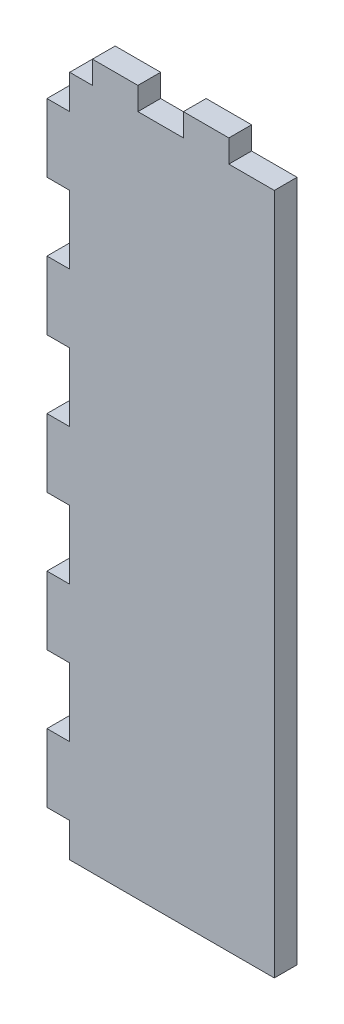
ISO-10303-21;
HEADER;
FILE_DESCRIPTION(('STEP AP214'),'2;1');
FILE_NAME('part.step','',(''),(''),'','','');
FILE_SCHEMA(('AUTOMOTIVE_DESIGN { 1 0 10303 214 1 1 1 1 }'));
ENDSEC;
DATA;
#1=APPLICATION_CONTEXT('core data for automotive mechanical design processes');
#2=APPLICATION_PROTOCOL_DEFINITION('international standard','automotive_design',2000,#1);
#3=PRODUCT_CONTEXT('',#1,'mechanical');
#4=PRODUCT('Part','Part','',(#3));
#5=PRODUCT_RELATED_PRODUCT_CATEGORY('part','',(#4));
#6=PRODUCT_DEFINITION_FORMATION('','',#4);
#7=PRODUCT_DEFINITION_CONTEXT('part definition',#1,'design');
#8=PRODUCT_DEFINITION('design','',#6,#7);
#9=PRODUCT_DEFINITION_SHAPE('','',#8);
#10=(LENGTH_UNIT() NAMED_UNIT(*) SI_UNIT(.MILLI.,.METRE.));
#11=(NAMED_UNIT(*) PLANE_ANGLE_UNIT() SI_UNIT($,.RADIAN.));
#12=(NAMED_UNIT(*) SI_UNIT($,.STERADIAN.) SOLID_ANGLE_UNIT());
#13=UNCERTAINTY_MEASURE_WITH_UNIT(LENGTH_MEASURE(1.E-05),#10,'distance_accuracy_value','');
#14=(GEOMETRIC_REPRESENTATION_CONTEXT(3) GLOBAL_UNCERTAINTY_ASSIGNED_CONTEXT((#13)) GLOBAL_UNIT_ASSIGNED_CONTEXT((#10,
#11,#12)) REPRESENTATION_CONTEXT('',''));
#15=CARTESIAN_POINT('',(0.,0.,0.));
#16=DIRECTION('',(0.,0.,1.));
#17=DIRECTION('',(1.,0.,0.));
#18=AXIS2_PLACEMENT_3D('',#15,#16,#17);
#19=CARTESIAN_POINT('',(0.,0.,5.));
#20=DIRECTION('',(0.,0.,-1.));
#21=DIRECTION('',(-1.,0.,0.));
#22=AXIS2_PLACEMENT_3D('',#19,#20,#21);
#23=PLANE('',#22);
#24=DIRECTION('',(0.,-1.,0.));
#25=VECTOR('',#24,1.);
#26=CARTESIAN_POINT('',(-52.8399776453055,44.7727272727273,5.));
#27=LINE('',#26,#25);
#28=CARTESIAN_POINT('',(-52.8399776453055,44.7727272727273,5.));
#29=VERTEX_POINT('',#28);
#30=CARTESIAN_POINT('',(-52.8399776453055,37.2727272727273,5.));
#31=VERTEX_POINT('',#30);
#32=EDGE_CURVE('E50',#29,#31,#27,.T.);
#33=ORIENTED_EDGE('',*,*,#32,.T.);
#34=DIRECTION('',(1.,0.,0.));
#35=VECTOR('',#34,1.);
#36=CARTESIAN_POINT('',(-57.8399776453055,37.2727272727273,5.));
#37=LINE('',#36,#35);
#38=CARTESIAN_POINT('',(-57.8399776453055,37.2727272727273,5.));
#39=VERTEX_POINT('',#38);
#40=EDGE_CURVE('E639',#39,#31,#37,.T.);
#41=ORIENTED_EDGE('',*,*,#40,.F.);
#42=DIRECTION('',(0.,-1.,0.));
#43=VECTOR('',#42,1.);
#44=CARTESIAN_POINT('',(-57.8399776453055,49.7727272727273,5.));
#45=LINE('',#44,#43);
#46=CARTESIAN_POINT('',(-57.8399776453055,22.2727272727273,5.));
#47=VERTEX_POINT('',#46);
#48=EDGE_CURVE('E43',#39,#47,#45,.T.);
#49=ORIENTED_EDGE('',*,*,#48,.T.);
#50=DIRECTION('',(1.,0.,0.));
#51=VECTOR('',#50,1.);
#52=CARTESIAN_POINT('',(-57.8399776453055,22.2727272727273,5.));
#53=LINE('',#52,#51);
#54=CARTESIAN_POINT('',(-52.8399776453055,22.2727272727273,5.));
#55=VERTEX_POINT('',#54);
#56=EDGE_CURVE('E359',#47,#55,#53,.T.);
#57=ORIENTED_EDGE('',*,*,#56,.T.);
#58=DIRECTION('',(0.,-1.,0.));
#59=VECTOR('',#58,1.);
#60=CARTESIAN_POINT('',(-52.8399776453055,22.2727272727273,5.));
#61=LINE('',#60,#59);
#62=CARTESIAN_POINT('',(-52.8399776453055,7.27272727272727,5.));
#63=VERTEX_POINT('',#62);
#64=EDGE_CURVE('E362',#55,#63,#61,.T.);
#65=ORIENTED_EDGE('',*,*,#64,.T.);
#66=DIRECTION('',(1.,0.,0.));
#67=VECTOR('',#66,1.);
#68=CARTESIAN_POINT('',(-57.8399776453055,7.27272727272727,5.));
#69=LINE('',#68,#67);
#70=CARTESIAN_POINT('',(-57.8399776453055,7.27272727272727,5.));
#71=VERTEX_POINT('',#70);
#72=EDGE_CURVE('E366',#71,#63,#69,.T.);
#73=ORIENTED_EDGE('',*,*,#72,.F.);
#74=CARTESIAN_POINT('',(-57.8399776453055,-7.72727272727273,5.));
#75=VERTEX_POINT('',#74);
#76=EDGE_CURVE('E424',#71,#75,#45,.T.);
#77=ORIENTED_EDGE('',*,*,#76,.T.);
#78=DIRECTION('',(1.,0.,0.));
#79=VECTOR('',#78,1.);
#80=CARTESIAN_POINT('',(-57.8399776453055,-7.72727272727273,5.));
#81=LINE('',#80,#79);
#82=CARTESIAN_POINT('',(-52.8399776453055,-7.72727272727273,5.));
#83=VERTEX_POINT('',#82);
#84=EDGE_CURVE('E383',#75,#83,#81,.T.);
#85=ORIENTED_EDGE('',*,*,#84,.T.);
#86=DIRECTION('',(0.,-1.,0.));
#87=VECTOR('',#86,1.);
#88=CARTESIAN_POINT('',(-52.8399776453055,-7.72727272727273,5.));
#89=LINE('',#88,#87);
#90=CARTESIAN_POINT('',(-52.8399776453055,-22.7272727272727,5.));
#91=VERTEX_POINT('',#90);
#92=EDGE_CURVE('E386',#83,#91,#89,.T.);
#93=ORIENTED_EDGE('',*,*,#92,.T.);
#94=DIRECTION('',(1.,0.,0.));
#95=VECTOR('',#94,1.);
#96=CARTESIAN_POINT('',(-57.8399776453055,-22.7272727272727,5.));
#97=LINE('',#96,#95);
#98=CARTESIAN_POINT('',(-57.8399776453055,-22.7272727272727,5.));
#99=VERTEX_POINT('',#98);
#100=EDGE_CURVE('E389',#99,#91,#97,.T.);
#101=ORIENTED_EDGE('',*,*,#100,.F.);
#102=CARTESIAN_POINT('',(-57.8399776453055,-37.7272727272727,5.));
#103=VERTEX_POINT('',#102);
#104=EDGE_CURVE('E426',#99,#103,#45,.T.);
#105=ORIENTED_EDGE('',*,*,#104,.T.);
#106=DIRECTION('',(1.,0.,0.));
#107=VECTOR('',#106,1.);
#108=CARTESIAN_POINT('',(-57.8399776453055,-37.7272727272727,5.));
#109=LINE('',#108,#107);
#110=CARTESIAN_POINT('',(-52.8399776453055,-37.7272727272727,5.));
#111=VERTEX_POINT('',#110);
#112=EDGE_CURVE('E307',#103,#111,#109,.T.);
#113=ORIENTED_EDGE('',*,*,#112,.T.);
#114=DIRECTION('',(0.,-1.,0.));
#115=VECTOR('',#114,1.);
#116=CARTESIAN_POINT('',(-52.8399776453055,-37.7272727272727,5.));
#117=LINE('',#116,#115);
#118=CARTESIAN_POINT('',(-52.8399776453055,-52.7272727272727,5.));
#119=VERTEX_POINT('',#118);
#120=EDGE_CURVE('E503',#111,#119,#117,.T.);
#121=ORIENTED_EDGE('',*,*,#120,.T.);
#122=DIRECTION('',(1.,0.,0.));
#123=VECTOR('',#122,1.);
#124=CARTESIAN_POINT('',(-57.8399776453055,-52.7272727272727,5.));
#125=LINE('',#124,#123);
#126=CARTESIAN_POINT('',(-57.8399776453055,-52.7272727272727,5.));
#127=VERTEX_POINT('',#126);
#128=EDGE_CURVE('E303',#127,#119,#125,.T.);
#129=ORIENTED_EDGE('',*,*,#128,.F.);
#130=CARTESIAN_POINT('',(-57.8399776453055,-67.7272727272727,5.));
#131=VERTEX_POINT('',#130);
#132=EDGE_CURVE('E425',#127,#131,#45,.T.);
#133=ORIENTED_EDGE('',*,*,#132,.T.);
#134=DIRECTION('',(1.,0.,0.));
#135=VECTOR('',#134,1.);
#136=CARTESIAN_POINT('',(-57.8399776453055,-67.7272727272727,5.));
#137=LINE('',#136,#135);
#138=CARTESIAN_POINT('',(-52.8399776453055,-67.7272727272727,5.));
#139=VERTEX_POINT('',#138);
#140=EDGE_CURVE('E326',#131,#139,#137,.T.);
#141=ORIENTED_EDGE('',*,*,#140,.T.);
#142=DIRECTION('',(0.,-1.,0.));
#143=VECTOR('',#142,1.);
#144=CARTESIAN_POINT('',(-52.8399776453055,-67.7272727272727,5.));
#145=LINE('',#144,#143);
#146=CARTESIAN_POINT('',(-52.8399776453055,-82.7272727272727,5.));
#147=VERTEX_POINT('',#146);
#148=EDGE_CURVE('E322',#139,#147,#145,.T.);
#149=ORIENTED_EDGE('',*,*,#148,.T.);
#150=DIRECTION('',(1.,0.,0.));
#151=VECTOR('',#150,1.);
#152=CARTESIAN_POINT('',(-57.8399776453055,-82.7272727272727,5.));
#153=LINE('',#152,#151);
#154=CARTESIAN_POINT('',(-57.8399776453055,-82.7272727272727,5.));
#155=VERTEX_POINT('',#154);
#156=EDGE_CURVE('E319',#155,#147,#153,.T.);
#157=ORIENTED_EDGE('',*,*,#156,.F.);
#158=CARTESIAN_POINT('',(-57.8399776453055,-97.7272727272727,5.));
#159=VERTEX_POINT('',#158);
#160=EDGE_CURVE('E422',#155,#159,#45,.T.);
#161=ORIENTED_EDGE('',*,*,#160,.T.);
#162=DIRECTION('',(1.,0.,0.));
#163=VECTOR('',#162,1.);
#164=CARTESIAN_POINT('',(-57.8399776453055,-97.7272727272727,5.));
#165=LINE('',#164,#163);
#166=CARTESIAN_POINT('',(-52.8399776453055,-97.7272727272727,5.));
#167=VERTEX_POINT('',#166);
#168=EDGE_CURVE('E342',#159,#167,#165,.T.);
#169=ORIENTED_EDGE('',*,*,#168,.T.);
#170=DIRECTION('',(0.,-1.,0.));
#171=VECTOR('',#170,1.);
#172=CARTESIAN_POINT('',(-52.8399776453055,-97.7272727272727,5.));
#173=LINE('',#172,#171);
#174=CARTESIAN_POINT('',(-52.8399776453055,-105.227272727273,5.));
#175=VERTEX_POINT('',#174);
#176=EDGE_CURVE('E345',#167,#175,#173,.T.);
#177=ORIENTED_EDGE('',*,*,#176,.T.);
#178=DIRECTION('',(1.,0.,0.));
#179=VECTOR('',#178,1.);
#180=CARTESIAN_POINT('',(-57.8399776453055,-105.227272727273,5.));
#181=LINE('',#180,#179);
#182=CARTESIAN_POINT('',(-7.83997764530547,-105.227272727273,5.));
#183=VERTEX_POINT('',#182);
#184=EDGE_CURVE('E420',#175,#183,#181,.T.);
#185=ORIENTED_EDGE('',*,*,#184,.T.);
#186=DIRECTION('',(0.,-1.,0.));
#187=VECTOR('',#186,1.);
#188=CARTESIAN_POINT('',(-7.83997764530549,49.7727272727273,5.));
#189=LINE('',#188,#187);
#190=CARTESIAN_POINT('',(-7.83997764530549,44.7727272727273,5.));
#191=VERTEX_POINT('',#190);
#192=EDGE_CURVE('E417',#191,#183,#189,.T.);
#193=ORIENTED_EDGE('',*,*,#192,.F.);
#194=DIRECTION('',(-1.,0.,0.));
#195=VECTOR('',#194,1.);
#196=CARTESIAN_POINT('',(-7.83997764530549,44.7727272727273,5.));
#197=LINE('',#196,#195);
#198=CARTESIAN_POINT('',(-17.8399776453055,44.7727272727273,5.));
#199=VERTEX_POINT('',#198);
#200=EDGE_CURVE('E401',#191,#199,#197,.T.);
#201=ORIENTED_EDGE('',*,*,#200,.T.);
#202=DIRECTION('',(0.,-1.,0.));
#203=VECTOR('',#202,1.);
#204=CARTESIAN_POINT('',(-17.8399776453055,49.7727272727273,5.));
#205=LINE('',#204,#203);
#206=CARTESIAN_POINT('',(-17.8399776453055,49.7727272727273,5.));
#207=VERTEX_POINT('',#206);
#208=EDGE_CURVE('E392',#207,#199,#205,.T.);
#209=ORIENTED_EDGE('',*,*,#208,.F.);
#210=DIRECTION('',(1.,0.,0.));
#211=VECTOR('',#210,1.);
#212=CARTESIAN_POINT('',(-57.8399776453055,49.7727272727273,5.));
#213=LINE('',#212,#211);
#214=CARTESIAN_POINT('',(-27.8399776453055,49.7727272727273,5.));
#215=VERTEX_POINT('',#214);
#216=EDGE_CURVE('E268',#215,#207,#213,.T.);
#217=ORIENTED_EDGE('',*,*,#216,.F.);
#218=DIRECTION('',(0.,-1.,0.));
#219=VECTOR('',#218,1.);
#220=CARTESIAN_POINT('',(-27.8399776453055,49.7727272727273,5.));
#221=LINE('',#220,#219);
#222=CARTESIAN_POINT('',(-27.8399776453055,44.7727272727273,5.));
#223=VERTEX_POINT('',#222);
#224=EDGE_CURVE('E475',#215,#223,#221,.T.);
#225=ORIENTED_EDGE('',*,*,#224,.T.);
#226=DIRECTION('',(1.,0.,0.));
#227=VECTOR('',#226,1.);
#228=CARTESIAN_POINT('',(-37.8399776453055,44.7727272727273,5.));
#229=LINE('',#228,#227);
#230=CARTESIAN_POINT('',(-37.8399776453055,44.7727272727273,5.));
#231=VERTEX_POINT('',#230);
#232=EDGE_CURVE('E478',#231,#223,#229,.T.);
#233=ORIENTED_EDGE('',*,*,#232,.F.);
#234=DIRECTION('',(0.,-1.,0.));
#235=VECTOR('',#234,1.);
#236=CARTESIAN_POINT('',(-37.8399776453055,49.7727272727273,5.));
#237=LINE('',#236,#235);
#238=CARTESIAN_POINT('',(-37.8399776453055,49.7727272727273,5.));
#239=VERTEX_POINT('',#238);
#240=EDGE_CURVE('E482',#239,#231,#237,.T.);
#241=ORIENTED_EDGE('',*,*,#240,.F.);
#242=CARTESIAN_POINT('',(-47.8399776453055,49.7727272727273,5.));
#243=VERTEX_POINT('',#242);
#244=EDGE_CURVE('E272',#243,#239,#213,.T.);
#245=ORIENTED_EDGE('',*,*,#244,.F.);
#246=DIRECTION('',(0.,1.,0.));
#247=VECTOR('',#246,1.);
#248=CARTESIAN_POINT('',(-47.8399776453055,49.7727272727273,5.));
#249=LINE('',#248,#247);
#250=CARTESIAN_POINT('',(-47.8399776453055,44.7727272727273,5.));
#251=VERTEX_POINT('',#250);
#252=EDGE_CURVE('E58',#251,#243,#249,.T.);
#253=ORIENTED_EDGE('',*,*,#252,.F.);
#254=DIRECTION('',(1.,0.,0.));
#255=VECTOR('',#254,1.);
#256=CARTESIAN_POINT('',(-57.8399776453055,44.7727272727273,5.));
#257=LINE('',#256,#255);
#258=EDGE_CURVE('E647',#29,#251,#257,.T.);
#259=ORIENTED_EDGE('',*,*,#258,.F.);
#260=EDGE_LOOP('',(#33,#41,#49,#57,#65,#73,#77,#85,#93,#101,#105,#113,#121,#129,#133,#141,#149,
#157,#161,#169,#177,#185,#193,#201,#209,#217,#225,#233,#241,#245,#253,#259));
#261=FACE_BOUND('',#260,.T.);
#262=ADVANCED_FACE('F35',(#261),#23,.F.);
#263=CARTESIAN_POINT('',(0.,0.,0.));
#264=DIRECTION('',(0.,0.,-1.));
#265=DIRECTION('',(-1.,0.,0.));
#266=AXIS2_PLACEMENT_3D('',#263,#264,#265);
#267=PLANE('',#266);
#268=DIRECTION('',(1.,0.,0.));
#269=VECTOR('',#268,1.);
#270=CARTESIAN_POINT('',(-57.8399776453055,37.2727272727273,0.));
#271=LINE('',#270,#269);
#272=CARTESIAN_POINT('',(-57.8399776453055,37.2727272727273,0.));
#273=VERTEX_POINT('',#272);
#274=CARTESIAN_POINT('',(-52.8399776453055,37.2727272727273,0.));
#275=VERTEX_POINT('',#274);
#276=EDGE_CURVE('E245',#273,#275,#271,.T.);
#277=ORIENTED_EDGE('',*,*,#276,.T.);
#278=DIRECTION('',(0.,-1.,0.));
#279=VECTOR('',#278,1.);
#280=CARTESIAN_POINT('',(-52.8399776453055,44.7727272727273,0.));
#281=LINE('',#280,#279);
#282=CARTESIAN_POINT('',(-52.8399776453055,44.7727272727273,0.));
#283=VERTEX_POINT('',#282);
#284=EDGE_CURVE('E255',#283,#275,#281,.T.);
#285=ORIENTED_EDGE('',*,*,#284,.F.);
#286=DIRECTION('',(1.,0.,0.));
#287=VECTOR('',#286,1.);
#288=CARTESIAN_POINT('',(-57.8399776453055,44.7727272727273,0.));
#289=LINE('',#288,#287);
#290=CARTESIAN_POINT('',(-47.8399776453055,44.7727272727273,0.));
#291=VERTEX_POINT('',#290);
#292=EDGE_CURVE('E649',#283,#291,#289,.T.);
#293=ORIENTED_EDGE('',*,*,#292,.T.);
#294=DIRECTION('',(0.,1.,0.));
#295=VECTOR('',#294,1.);
#296=CARTESIAN_POINT('',(-47.8399776453055,49.7727272727273,0.));
#297=LINE('',#296,#295);
#298=CARTESIAN_POINT('',(-47.8399776453055,49.7727272727273,0.));
#299=VERTEX_POINT('',#298);
#300=EDGE_CURVE('E651',#291,#299,#297,.T.);
#301=ORIENTED_EDGE('',*,*,#300,.T.);
#302=DIRECTION('',(1.,0.,0.));
#303=VECTOR('',#302,1.);
#304=CARTESIAN_POINT('',(-57.8399776453055,49.7727272727273,0.));
#305=LINE('',#304,#303);
#306=CARTESIAN_POINT('',(-37.8399776453055,49.7727272727273,0.));
#307=VERTEX_POINT('',#306);
#308=EDGE_CURVE('E427',#299,#307,#305,.T.);
#309=ORIENTED_EDGE('',*,*,#308,.T.);
#310=DIRECTION('',(0.,-1.,0.));
#311=VECTOR('',#310,1.);
#312=CARTESIAN_POINT('',(-37.8399776453055,49.7727272727273,0.));
#313=LINE('',#312,#311);
#314=CARTESIAN_POINT('',(-37.8399776453055,44.7727272727273,0.));
#315=VERTEX_POINT('',#314);
#316=EDGE_CURVE('E480',#307,#315,#313,.T.);
#317=ORIENTED_EDGE('',*,*,#316,.T.);
#318=DIRECTION('',(1.,0.,0.));
#319=VECTOR('',#318,1.);
#320=CARTESIAN_POINT('',(-37.8399776453055,44.7727272727273,0.));
#321=LINE('',#320,#319);
#322=CARTESIAN_POINT('',(-27.8399776453055,44.7727272727273,0.));
#323=VERTEX_POINT('',#322);
#324=EDGE_CURVE('E485',#315,#323,#321,.T.);
#325=ORIENTED_EDGE('',*,*,#324,.T.);
#326=DIRECTION('',(0.,-1.,0.));
#327=VECTOR('',#326,1.);
#328=CARTESIAN_POINT('',(-27.8399776453055,49.7727272727273,0.));
#329=LINE('',#328,#327);
#330=CARTESIAN_POINT('',(-27.8399776453055,49.7727272727273,0.));
#331=VERTEX_POINT('',#330);
#332=EDGE_CURVE('E493',#331,#323,#329,.T.);
#333=ORIENTED_EDGE('',*,*,#332,.F.);
#334=CARTESIAN_POINT('',(-17.8399776453055,49.7727272727273,0.));
#335=VERTEX_POINT('',#334);
#336=EDGE_CURVE('E412',#331,#335,#305,.T.);
#337=ORIENTED_EDGE('',*,*,#336,.T.);
#338=DIRECTION('',(0.,-1.,0.));
#339=VECTOR('',#338,1.);
#340=CARTESIAN_POINT('',(-17.8399776453055,49.7727272727273,0.));
#341=LINE('',#340,#339);
#342=CARTESIAN_POINT('',(-17.8399776453055,44.7727272727273,0.));
#343=VERTEX_POINT('',#342);
#344=EDGE_CURVE('E397',#335,#343,#341,.T.);
#345=ORIENTED_EDGE('',*,*,#344,.T.);
#346=DIRECTION('',(-1.,0.,0.));
#347=VECTOR('',#346,1.);
#348=CARTESIAN_POINT('',(-7.83997764530549,44.7727272727273,0.));
#349=LINE('',#348,#347);
#350=CARTESIAN_POINT('',(-7.83997764530549,44.7727272727273,0.));
#351=VERTEX_POINT('',#350);
#352=EDGE_CURVE('E400',#351,#343,#349,.T.);
#353=ORIENTED_EDGE('',*,*,#352,.F.);
#354=DIRECTION('',(0.,-1.,0.));
#355=VECTOR('',#354,1.);
#356=CARTESIAN_POINT('',(-7.83997764530549,49.7727272727273,0.));
#357=LINE('',#356,#355);
#358=CARTESIAN_POINT('',(-7.83997764530547,-105.227272727273,0.));
#359=VERTEX_POINT('',#358);
#360=EDGE_CURVE('E429',#351,#359,#357,.T.);
#361=ORIENTED_EDGE('',*,*,#360,.T.);
#362=DIRECTION('',(1.,0.,0.));
#363=VECTOR('',#362,1.);
#364=CARTESIAN_POINT('',(-57.8399776453055,-105.227272727273,0.));
#365=LINE('',#364,#363);
#366=CARTESIAN_POINT('',(-52.8399776453055,-105.227272727273,0.));
#367=VERTEX_POINT('',#366);
#368=EDGE_CURVE('E431',#367,#359,#365,.T.);
#369=ORIENTED_EDGE('',*,*,#368,.F.);
#370=DIRECTION('',(0.,-1.,0.));
#371=VECTOR('',#370,1.);
#372=CARTESIAN_POINT('',(-52.8399776453055,-97.7272727272727,0.));
#373=LINE('',#372,#371);
#374=CARTESIAN_POINT('',(-52.8399776453055,-97.7272727272727,0.));
#375=VERTEX_POINT('',#374);
#376=EDGE_CURVE('E346',#375,#367,#373,.T.);
#377=ORIENTED_EDGE('',*,*,#376,.F.);
#378=DIRECTION('',(1.,0.,0.));
#379=VECTOR('',#378,1.);
#380=CARTESIAN_POINT('',(-57.8399776453055,-97.7272727272727,0.));
#381=LINE('',#380,#379);
#382=CARTESIAN_POINT('',(-57.8399776453055,-97.7272727272727,0.));
#383=VERTEX_POINT('',#382);
#384=EDGE_CURVE('E337',#383,#375,#381,.T.);
#385=ORIENTED_EDGE('',*,*,#384,.F.);
#386=DIRECTION('',(0.,-1.,0.));
#387=VECTOR('',#386,1.);
#388=CARTESIAN_POINT('',(-57.8399776453055,49.7727272727273,0.));
#389=LINE('',#388,#387);
#390=CARTESIAN_POINT('',(-57.8399776453055,-82.7272727272728,0.));
#391=VERTEX_POINT('',#390);
#392=EDGE_CURVE('E274',#391,#383,#389,.T.);
#393=ORIENTED_EDGE('',*,*,#392,.F.);
#394=DIRECTION('',(1.,0.,0.));
#395=VECTOR('',#394,1.);
#396=CARTESIAN_POINT('',(-57.8399776453055,-82.7272727272727,0.));
#397=LINE('',#396,#395);
#398=CARTESIAN_POINT('',(-52.8399776453055,-82.7272727272727,0.));
#399=VERTEX_POINT('',#398);
#400=EDGE_CURVE('E318',#391,#399,#397,.T.);
#401=ORIENTED_EDGE('',*,*,#400,.T.);
#402=DIRECTION('',(0.,-1.,0.));
#403=VECTOR('',#402,1.);
#404=CARTESIAN_POINT('',(-52.8399776453055,-67.7272727272727,0.));
#405=LINE('',#404,#403);
#406=CARTESIAN_POINT('',(-52.8399776453055,-67.7272727272727,0.));
#407=VERTEX_POINT('',#406);
#408=EDGE_CURVE('E332',#407,#399,#405,.T.);
#409=ORIENTED_EDGE('',*,*,#408,.F.);
#410=DIRECTION('',(1.,0.,0.));
#411=VECTOR('',#410,1.);
#412=CARTESIAN_POINT('',(-57.8399776453055,-67.7272727272727,0.));
#413=LINE('',#412,#411);
#414=CARTESIAN_POINT('',(-57.8399776453055,-67.7272727272727,0.));
#415=VERTEX_POINT('',#414);
#416=EDGE_CURVE('E323',#415,#407,#413,.T.);
#417=ORIENTED_EDGE('',*,*,#416,.F.);
#418=CARTESIAN_POINT('',(-57.8399776453055,-52.7272727272727,0.));
#419=VERTEX_POINT('',#418);
#420=EDGE_CURVE('E270',#419,#415,#389,.T.);
#421=ORIENTED_EDGE('',*,*,#420,.F.);
#422=DIRECTION('',(1.,0.,0.));
#423=VECTOR('',#422,1.);
#424=CARTESIAN_POINT('',(-57.8399776453055,-52.7272727272727,0.));
#425=LINE('',#424,#423);
#426=CARTESIAN_POINT('',(-52.8399776453055,-52.7272727272727,0.));
#427=VERTEX_POINT('',#426);
#428=EDGE_CURVE('E298',#419,#427,#425,.T.);
#429=ORIENTED_EDGE('',*,*,#428,.T.);
#430=DIRECTION('',(0.,-1.,0.));
#431=VECTOR('',#430,1.);
#432=CARTESIAN_POINT('',(-52.8399776453055,-37.7272727272727,0.));
#433=LINE('',#432,#431);
#434=CARTESIAN_POINT('',(-52.8399776453055,-37.7272727272727,0.));
#435=VERTEX_POINT('',#434);
#436=EDGE_CURVE('E293',#435,#427,#433,.T.);
#437=ORIENTED_EDGE('',*,*,#436,.F.);
#438=DIRECTION('',(1.,0.,0.));
#439=VECTOR('',#438,1.);
#440=CARTESIAN_POINT('',(-57.8399776453055,-37.7272727272727,0.));
#441=LINE('',#440,#439);
#442=CARTESIAN_POINT('',(-57.8399776453055,-37.7272727272727,0.));
#443=VERTEX_POINT('',#442);
#444=EDGE_CURVE('E291',#443,#435,#441,.T.);
#445=ORIENTED_EDGE('',*,*,#444,.F.);
#446=CARTESIAN_POINT('',(-57.8399776453055,-22.7272727272727,0.));
#447=VERTEX_POINT('',#446);
#448=EDGE_CURVE('E271',#447,#443,#389,.T.);
#449=ORIENTED_EDGE('',*,*,#448,.F.);
#450=DIRECTION('',(1.,0.,0.));
#451=VECTOR('',#450,1.);
#452=CARTESIAN_POINT('',(-57.8399776453055,-22.7272727272727,0.));
#453=LINE('',#452,#451);
#454=CARTESIAN_POINT('',(-52.8399776453055,-22.7272727272727,0.));
#455=VERTEX_POINT('',#454);
#456=EDGE_CURVE('E289',#447,#455,#453,.T.);
#457=ORIENTED_EDGE('',*,*,#456,.T.);
#458=DIRECTION('',(0.,-1.,0.));
#459=VECTOR('',#458,1.);
#460=CARTESIAN_POINT('',(-52.8399776453055,-7.72727272727273,0.));
#461=LINE('',#460,#459);
#462=CARTESIAN_POINT('',(-52.8399776453055,-7.72727272727273,0.));
#463=VERTEX_POINT('',#462);
#464=EDGE_CURVE('E394',#463,#455,#461,.T.);
#465=ORIENTED_EDGE('',*,*,#464,.F.);
#466=DIRECTION('',(1.,0.,0.));
#467=VECTOR('',#466,1.);
#468=CARTESIAN_POINT('',(-57.8399776453055,-7.72727272727273,0.));
#469=LINE('',#468,#467);
#470=CARTESIAN_POINT('',(-57.8399776453055,-7.72727272727273,0.));
#471=VERTEX_POINT('',#470);
#472=EDGE_CURVE('E376',#471,#463,#469,.T.);
#473=ORIENTED_EDGE('',*,*,#472,.F.);
#474=CARTESIAN_POINT('',(-57.8399776453055,7.27272727272727,0.));
#475=VERTEX_POINT('',#474);
#476=EDGE_CURVE('E269',#475,#471,#389,.T.);
#477=ORIENTED_EDGE('',*,*,#476,.F.);
#478=DIRECTION('',(1.,0.,0.));
#479=VECTOR('',#478,1.);
#480=CARTESIAN_POINT('',(-57.8399776453055,7.27272727272727,0.));
#481=LINE('',#480,#479);
#482=CARTESIAN_POINT('',(-52.8399776453055,7.27272727272727,0.));
#483=VERTEX_POINT('',#482);
#484=EDGE_CURVE('E363',#475,#483,#481,.T.);
#485=ORIENTED_EDGE('',*,*,#484,.T.);
#486=DIRECTION('',(0.,-1.,0.));
#487=VECTOR('',#486,1.);
#488=CARTESIAN_POINT('',(-52.8399776453055,22.2727272727273,0.));
#489=LINE('',#488,#487);
#490=CARTESIAN_POINT('',(-52.8399776453055,22.2727272727273,0.));
#491=VERTEX_POINT('',#490);
#492=EDGE_CURVE('E371',#491,#483,#489,.T.);
#493=ORIENTED_EDGE('',*,*,#492,.F.);
#494=DIRECTION('',(1.,0.,0.));
#495=VECTOR('',#494,1.);
#496=CARTESIAN_POINT('',(-57.8399776453055,22.2727272727273,0.));
#497=LINE('',#496,#495);
#498=CARTESIAN_POINT('',(-57.8399776453055,22.2727272727273,0.));
#499=VERTEX_POINT('',#498);
#500=EDGE_CURVE('E267',#499,#491,#497,.T.);
#501=ORIENTED_EDGE('',*,*,#500,.F.);
#502=EDGE_CURVE('E261',#273,#499,#389,.T.);
#503=ORIENTED_EDGE('',*,*,#502,.F.);
#504=EDGE_LOOP('',(#277,#285,#293,#301,#309,#317,#325,#333,#337,#345,#353,#361,#369,#377,#385,
#393,#401,#409,#417,#421,#429,#437,#445,#449,#457,#465,#473,#477,#485,#493,#501,#503));
#505=FACE_BOUND('',#504,.T.);
#506=ADVANCED_FACE('F265',(#505),#267,.T.);
#507=CARTESIAN_POINT('',(-57.8399776453055,44.7727272727273,0.));
#508=DIRECTION('',(0.,-1.,0.));
#509=DIRECTION('',(0.,0.,-1.));
#510=AXIS2_PLACEMENT_3D('',#507,#508,#509);
#511=PLANE('',#510);
#512=DIRECTION('',(0.,0.,1.));
#513=VECTOR('',#512,1.);
#514=CARTESIAN_POINT('',(-52.8399776453055,44.7727272727273,0.));
#515=LINE('',#514,#513);
#516=EDGE_CURVE('E645',#283,#29,#515,.T.);
#517=ORIENTED_EDGE('',*,*,#516,.T.);
#518=ORIENTED_EDGE('',*,*,#258,.T.);
#519=DIRECTION('',(0.,0.,1.));
#520=VECTOR('',#519,1.);
#521=CARTESIAN_POINT('',(-47.8399776453055,44.7727272727273,0.));
#522=LINE('',#521,#520);
#523=EDGE_CURVE('E654',#291,#251,#522,.T.);
#524=ORIENTED_EDGE('',*,*,#523,.F.);
#525=ORIENTED_EDGE('',*,*,#292,.F.);
#526=EDGE_LOOP('',(#517,#518,#524,#525));
#527=FACE_BOUND('',#526,.T.);
#528=ADVANCED_FACE('F554',(#527),#511,.F.);
#529=CARTESIAN_POINT('',(-57.8399776453055,49.7727272727273,5.));
#530=DIRECTION('',(0.,1.,0.));
#531=DIRECTION('',(0.,0.,1.));
#532=AXIS2_PLACEMENT_3D('',#529,#530,#531);
#533=PLANE('',#532);
#534=ORIENTED_EDGE('',*,*,#336,.F.);
#535=DIRECTION('',(0.,0.,1.));
#536=VECTOR('',#535,1.);
#537=CARTESIAN_POINT('',(-27.8399776453055,49.7727272727273,0.));
#538=LINE('',#537,#536);
#539=EDGE_CURVE('E472',#331,#215,#538,.T.);
#540=ORIENTED_EDGE('',*,*,#539,.T.);
#541=ORIENTED_EDGE('',*,*,#216,.T.);
#542=DIRECTION('',(0.,0.,1.));
#543=VECTOR('',#542,1.);
#544=CARTESIAN_POINT('',(-17.8399776453055,49.7727272727273,0.));
#545=LINE('',#544,#543);
#546=EDGE_CURVE('E404',#335,#207,#545,.T.);
#547=ORIENTED_EDGE('',*,*,#546,.F.);
#548=EDGE_LOOP('',(#534,#540,#541,#547));
#549=FACE_BOUND('',#548,.T.);
#550=ADVANCED_FACE('F469',(#549),#533,.T.);
#551=CARTESIAN_POINT('',(-57.8399776453055,49.7727272727273,5.));
#552=DIRECTION('',(1.,0.,0.));
#553=DIRECTION('',(0.,1.,0.));
#554=AXIS2_PLACEMENT_3D('',#551,#552,#553);
#555=PLANE('',#554);
#556=DIRECTION('',(0.,0.,1.));
#557=VECTOR('',#556,1.);
#558=CARTESIAN_POINT('',(-57.8399776453055,-37.7272727272727,0.));
#559=LINE('',#558,#557);
#560=EDGE_CURVE('E283',#443,#103,#559,.T.);
#561=ORIENTED_EDGE('',*,*,#560,.T.);
#562=ORIENTED_EDGE('',*,*,#104,.F.);
#563=DIRECTION('',(0.,0.,1.));
#564=VECTOR('',#563,1.);
#565=CARTESIAN_POINT('',(-57.8399776453055,-22.7272727272727,0.));
#566=LINE('',#565,#564);
#567=EDGE_CURVE('E285',#447,#99,#566,.T.);
#568=ORIENTED_EDGE('',*,*,#567,.F.);
#569=ORIENTED_EDGE('',*,*,#448,.T.);
#570=EDGE_LOOP('',(#561,#562,#568,#569));
#571=FACE_BOUND('',#570,.T.);
#572=ADVANCED_FACE('F281',(#571),#555,.F.);
#573=ORIENTED_EDGE('',*,*,#132,.F.);
#574=DIRECTION('',(0.,0.,1.));
#575=VECTOR('',#574,1.);
#576=CARTESIAN_POINT('',(-57.8399776453055,-52.7272727272727,0.));
#577=LINE('',#576,#575);
#578=EDGE_CURVE('E296',#419,#127,#577,.T.);
#579=ORIENTED_EDGE('',*,*,#578,.F.);
#580=ORIENTED_EDGE('',*,*,#420,.T.);
#581=DIRECTION('',(0.,0.,1.));
#582=VECTOR('',#581,1.);
#583=CARTESIAN_POINT('',(-57.8399776453055,-67.7272727272727,0.));
#584=LINE('',#583,#582);
#585=EDGE_CURVE('E315',#415,#131,#584,.T.);
#586=ORIENTED_EDGE('',*,*,#585,.T.);
#587=EDGE_LOOP('',(#573,#579,#580,#586));
#588=FACE_BOUND('',#587,.T.);
#589=ADVANCED_FACE('F515',(#588),#555,.F.);
#590=ORIENTED_EDGE('',*,*,#160,.F.);
#591=DIRECTION('',(0.,0.,1.));
#592=VECTOR('',#591,1.);
#593=CARTESIAN_POINT('',(-57.8399776453055,-82.7272727272727,0.));
#594=LINE('',#593,#592);
#595=EDGE_CURVE('E313',#391,#155,#594,.T.);
#596=ORIENTED_EDGE('',*,*,#595,.F.);
#597=ORIENTED_EDGE('',*,*,#392,.T.);
#598=DIRECTION('',(0.,0.,1.));
#599=VECTOR('',#598,1.);
#600=CARTESIAN_POINT('',(-57.8399776453055,-97.7272727272727,0.));
#601=LINE('',#600,#599);
#602=EDGE_CURVE('E329',#383,#159,#601,.T.);
#603=ORIENTED_EDGE('',*,*,#602,.T.);
#604=EDGE_LOOP('',(#590,#596,#597,#603));
#605=FACE_BOUND('',#604,.T.);
#606=ADVANCED_FACE('F441',(#605),#555,.F.);
#607=CARTESIAN_POINT('',(-57.8399776453055,-105.227272727273,5.));
#608=DIRECTION('',(0.,1.,0.));
#609=DIRECTION('',(0.,0.,1.));
#610=AXIS2_PLACEMENT_3D('',#607,#608,#609);
#611=PLANE('',#610);
#612=DIRECTION('',(0.,0.,1.));
#613=VECTOR('',#612,1.);
#614=CARTESIAN_POINT('',(-52.8399776453055,-105.227272727273,0.));
#615=LINE('',#614,#613);
#616=EDGE_CURVE('E335',#367,#175,#615,.T.);
#617=ORIENTED_EDGE('',*,*,#616,.F.);
#618=ORIENTED_EDGE('',*,*,#368,.T.);
#619=DIRECTION('',(0.,0.,-1.));
#620=VECTOR('',#619,1.);
#621=CARTESIAN_POINT('',(-7.83997764530547,-105.227272727273,5.));
#622=LINE('',#621,#620);
#623=EDGE_CURVE('E12',#183,#359,#622,.T.);
#624=ORIENTED_EDGE('',*,*,#623,.F.);
#625=ORIENTED_EDGE('',*,*,#184,.F.);
#626=EDGE_LOOP('',(#617,#618,#624,#625));
#627=FACE_BOUND('',#626,.T.);
#628=ADVANCED_FACE('F452',(#627),#611,.F.);
#629=ORIENTED_EDGE('',*,*,#48,.F.);
#630=DIRECTION('',(0.,0.,1.));
#631=VECTOR('',#630,1.);
#632=CARTESIAN_POINT('',(-57.8399776453055,37.2727272727273,0.));
#633=LINE('',#632,#631);
#634=EDGE_CURVE('E249',#273,#39,#633,.T.);
#635=ORIENTED_EDGE('',*,*,#634,.F.);
#636=ORIENTED_EDGE('',*,*,#502,.T.);
#637=DIRECTION('',(0.,0.,1.));
#638=VECTOR('',#637,1.);
#639=CARTESIAN_POINT('',(-57.8399776453055,22.2727272727273,0.));
#640=LINE('',#639,#638);
#641=EDGE_CURVE('E349',#499,#47,#640,.T.);
#642=ORIENTED_EDGE('',*,*,#641,.T.);
#643=EDGE_LOOP('',(#629,#635,#636,#642));
#644=FACE_BOUND('',#643,.T.);
#645=ADVANCED_FACE('F259',(#644),#555,.F.);
#646=ORIENTED_EDGE('',*,*,#76,.F.);
#647=DIRECTION('',(0.,0.,1.));
#648=VECTOR('',#647,1.);
#649=CARTESIAN_POINT('',(-57.8399776453055,7.27272727272727,0.));
#650=LINE('',#649,#648);
#651=EDGE_CURVE('E352',#475,#71,#650,.T.);
#652=ORIENTED_EDGE('',*,*,#651,.F.);
#653=ORIENTED_EDGE('',*,*,#476,.T.);
#654=DIRECTION('',(0.,0.,1.));
#655=VECTOR('',#654,1.);
#656=CARTESIAN_POINT('',(-57.8399776453055,-7.72727272727273,0.));
#657=LINE('',#656,#655);
#658=EDGE_CURVE('E369',#471,#75,#657,.T.);
#659=ORIENTED_EDGE('',*,*,#658,.T.);
#660=EDGE_LOOP('',(#646,#652,#653,#659));
#661=FACE_BOUND('',#660,.T.);
#662=ADVANCED_FACE('F530',(#661),#555,.F.);
#663=CARTESIAN_POINT('',(-7.83997764530549,49.7727272727273,5.));
#664=DIRECTION('',(1.,0.,0.));
#665=DIRECTION('',(0.,1.,0.));
#666=AXIS2_PLACEMENT_3D('',#663,#664,#665);
#667=PLANE('',#666);
#668=ORIENTED_EDGE('',*,*,#360,.F.);
#669=DIRECTION('',(0.,0.,1.));
#670=VECTOR('',#669,1.);
#671=CARTESIAN_POINT('',(-7.83997764530549,44.7727272727273,0.));
#672=LINE('',#671,#670);
#673=EDGE_CURVE('E409',#351,#191,#672,.T.);
#674=ORIENTED_EDGE('',*,*,#673,.T.);
#675=ORIENTED_EDGE('',*,*,#192,.T.);
#676=ORIENTED_EDGE('',*,*,#623,.T.);
#677=EDGE_LOOP('',(#668,#674,#675,#676));
#678=FACE_BOUND('',#677,.T.);
#679=ADVANCED_FACE('F457',(#678),#667,.T.);
#680=DIRECTION('',(0.,0.,1.));
#681=VECTOR('',#680,1.);
#682=CARTESIAN_POINT('',(-47.8399776453055,49.7727272727273,0.));
#683=LINE('',#682,#681);
#684=EDGE_CURVE('E657',#299,#243,#683,.T.);
#685=ORIENTED_EDGE('',*,*,#684,.T.);
#686=ORIENTED_EDGE('',*,*,#244,.T.);
#687=DIRECTION('',(0.,0.,1.));
#688=VECTOR('',#687,1.);
#689=CARTESIAN_POINT('',(-37.8399776453055,49.7727272727273,0.));
#690=LINE('',#689,#688);
#691=EDGE_CURVE('E488',#307,#239,#690,.T.);
#692=ORIENTED_EDGE('',*,*,#691,.F.);
#693=ORIENTED_EDGE('',*,*,#308,.F.);
#694=EDGE_LOOP('',(#685,#686,#692,#693));
#695=FACE_BOUND('',#694,.T.);
#696=ADVANCED_FACE('F37',(#695),#533,.T.);
#697=CARTESIAN_POINT('',(-7.83997764530549,44.7727272727273,0.));
#698=DIRECTION('',(0.,1.,0.));
#699=DIRECTION('',(0.,0.,1.));
#700=AXIS2_PLACEMENT_3D('',#697,#698,#699);
#701=PLANE('',#700);
#702=ORIENTED_EDGE('',*,*,#200,.F.);
#703=ORIENTED_EDGE('',*,*,#673,.F.);
#704=ORIENTED_EDGE('',*,*,#352,.T.);
#705=DIRECTION('',(0.,0.,1.));
#706=VECTOR('',#705,1.);
#707=CARTESIAN_POINT('',(-17.8399776453055,44.7727272727273,0.));
#708=LINE('',#707,#706);
#709=EDGE_CURVE('E413',#343,#199,#708,.T.);
#710=ORIENTED_EDGE('',*,*,#709,.T.);
#711=EDGE_LOOP('',(#702,#703,#704,#710));
#712=FACE_BOUND('',#711,.T.);
#713=ADVANCED_FACE('F460',(#712),#701,.T.);
#714=CARTESIAN_POINT('',(-17.8399776453055,49.7727272727273,0.));
#715=DIRECTION('',(-1.,0.,0.));
#716=DIRECTION('',(0.,-1.,0.));
#717=AXIS2_PLACEMENT_3D('',#714,#715,#716);
#718=PLANE('',#717);
#719=ORIENTED_EDGE('',*,*,#208,.T.);
#720=ORIENTED_EDGE('',*,*,#709,.F.);
#721=ORIENTED_EDGE('',*,*,#344,.F.);
#722=ORIENTED_EDGE('',*,*,#546,.T.);
#723=EDGE_LOOP('',(#719,#720,#721,#722));
#724=FACE_BOUND('',#723,.T.);
#725=ADVANCED_FACE('F466',(#724),#718,.F.);
#726=CARTESIAN_POINT('',(-57.8399776453055,-7.72727272727273,0.));
#727=DIRECTION('',(0.,-1.,0.));
#728=DIRECTION('',(0.,0.,-1.));
#729=AXIS2_PLACEMENT_3D('',#726,#727,#728);
#730=PLANE('',#729);
#731=ORIENTED_EDGE('',*,*,#84,.F.);
#732=ORIENTED_EDGE('',*,*,#658,.F.);
#733=ORIENTED_EDGE('',*,*,#472,.T.);
#734=DIRECTION('',(0.,0.,1.));
#735=VECTOR('',#734,1.);
#736=CARTESIAN_POINT('',(-52.8399776453055,-7.72727272727273,0.));
#737=LINE('',#736,#735);
#738=EDGE_CURVE('E379',#463,#83,#737,.T.);
#739=ORIENTED_EDGE('',*,*,#738,.T.);
#740=EDGE_LOOP('',(#731,#732,#733,#739));
#741=FACE_BOUND('',#740,.T.);
#742=ADVANCED_FACE('F526',(#741),#730,.T.);
#743=CARTESIAN_POINT('',(-52.8399776453055,-7.72727272727273,0.));
#744=DIRECTION('',(-1.,0.,0.));
#745=DIRECTION('',(0.,-1.,0.));
#746=AXIS2_PLACEMENT_3D('',#743,#744,#745);
#747=PLANE('',#746);
#748=ORIENTED_EDGE('',*,*,#92,.F.);
#749=ORIENTED_EDGE('',*,*,#738,.F.);
#750=ORIENTED_EDGE('',*,*,#464,.T.);
#751=DIRECTION('',(0.,0.,1.));
#752=VECTOR('',#751,1.);
#753=CARTESIAN_POINT('',(-52.8399776453055,-22.7272727272727,0.));
#754=LINE('',#753,#752);
#755=EDGE_CURVE('E377',#455,#91,#754,.T.);
#756=ORIENTED_EDGE('',*,*,#755,.T.);
#757=EDGE_LOOP('',(#748,#749,#750,#756));
#758=FACE_BOUND('',#757,.T.);
#759=ADVANCED_FACE('F533',(#758),#747,.T.);
#760=CARTESIAN_POINT('',(-57.8399776453055,-22.7272727272727,0.));
#761=DIRECTION('',(0.,-1.,0.));
#762=DIRECTION('',(0.,0.,-1.));
#763=AXIS2_PLACEMENT_3D('',#760,#761,#762);
#764=PLANE('',#763);
#765=ORIENTED_EDGE('',*,*,#100,.T.);
#766=ORIENTED_EDGE('',*,*,#755,.F.);
#767=ORIENTED_EDGE('',*,*,#456,.F.);
#768=ORIENTED_EDGE('',*,*,#567,.T.);
#769=EDGE_LOOP('',(#765,#766,#767,#768));
#770=FACE_BOUND('',#769,.T.);
#771=ADVANCED_FACE('F537',(#770),#764,.F.);
#772=CARTESIAN_POINT('',(-57.8399776453055,22.2727272727273,0.));
#773=DIRECTION('',(0.,-1.,0.));
#774=DIRECTION('',(0.,0.,-1.));
#775=AXIS2_PLACEMENT_3D('',#772,#773,#774);
#776=PLANE('',#775);
#777=ORIENTED_EDGE('',*,*,#56,.F.);
#778=ORIENTED_EDGE('',*,*,#641,.F.);
#779=ORIENTED_EDGE('',*,*,#500,.T.);
#780=DIRECTION('',(0.,0.,1.));
#781=VECTOR('',#780,1.);
#782=CARTESIAN_POINT('',(-52.8399776453055,22.2727272727273,0.));
#783=LINE('',#782,#781);
#784=EDGE_CURVE('E356',#491,#55,#783,.T.);
#785=ORIENTED_EDGE('',*,*,#784,.T.);
#786=EDGE_LOOP('',(#777,#778,#779,#785));
#787=FACE_BOUND('',#786,.T.);
#788=ADVANCED_FACE('F539',(#787),#776,.T.);
#789=CARTESIAN_POINT('',(-52.8399776453055,22.2727272727273,0.));
#790=DIRECTION('',(-1.,0.,0.));
#791=DIRECTION('',(0.,-1.,0.));
#792=AXIS2_PLACEMENT_3D('',#789,#790,#791);
#793=PLANE('',#792);
#794=ORIENTED_EDGE('',*,*,#64,.F.);
#795=ORIENTED_EDGE('',*,*,#784,.F.);
#796=ORIENTED_EDGE('',*,*,#492,.T.);
#797=DIRECTION('',(0.,0.,1.));
#798=VECTOR('',#797,1.);
#799=CARTESIAN_POINT('',(-52.8399776453055,7.27272727272727,0.));
#800=LINE('',#799,#798);
#801=EDGE_CURVE('E354',#483,#63,#800,.T.);
#802=ORIENTED_EDGE('',*,*,#801,.T.);
#803=EDGE_LOOP('',(#794,#795,#796,#802));
#804=FACE_BOUND('',#803,.T.);
#805=ADVANCED_FACE('F545',(#804),#793,.T.);
#806=CARTESIAN_POINT('',(-57.8399776453055,7.27272727272727,0.));
#807=DIRECTION('',(0.,-1.,0.));
#808=DIRECTION('',(0.,0.,-1.));
#809=AXIS2_PLACEMENT_3D('',#806,#807,#808);
#810=PLANE('',#809);
#811=ORIENTED_EDGE('',*,*,#72,.T.);
#812=ORIENTED_EDGE('',*,*,#801,.F.);
#813=ORIENTED_EDGE('',*,*,#484,.F.);
#814=ORIENTED_EDGE('',*,*,#651,.T.);
#815=EDGE_LOOP('',(#811,#812,#813,#814));
#816=FACE_BOUND('',#815,.T.);
#817=ADVANCED_FACE('F627',(#816),#810,.F.);
#818=CARTESIAN_POINT('',(-57.8399776453055,-97.7272727272727,0.));
#819=DIRECTION('',(0.,-1.,0.));
#820=DIRECTION('',(0.,0.,-1.));
#821=AXIS2_PLACEMENT_3D('',#818,#819,#820);
#822=PLANE('',#821);
#823=ORIENTED_EDGE('',*,*,#168,.F.);
#824=ORIENTED_EDGE('',*,*,#602,.F.);
#825=ORIENTED_EDGE('',*,*,#384,.T.);
#826=DIRECTION('',(0.,0.,1.));
#827=VECTOR('',#826,1.);
#828=CARTESIAN_POINT('',(-52.8399776453055,-97.7272727272727,0.));
#829=LINE('',#828,#827);
#830=EDGE_CURVE('E338',#375,#167,#829,.T.);
#831=ORIENTED_EDGE('',*,*,#830,.T.);
#832=EDGE_LOOP('',(#823,#824,#825,#831));
#833=FACE_BOUND('',#832,.T.);
#834=ADVANCED_FACE('F445',(#833),#822,.T.);
#835=CARTESIAN_POINT('',(-52.8399776453055,-97.7272727272727,0.));
#836=DIRECTION('',(-1.,0.,0.));
#837=DIRECTION('',(0.,0.,1.));
#838=AXIS2_PLACEMENT_3D('',#835,#836,#837);
#839=PLANE('',#838);
#840=ORIENTED_EDGE('',*,*,#176,.F.);
#841=ORIENTED_EDGE('',*,*,#830,.F.);
#842=ORIENTED_EDGE('',*,*,#376,.T.);
#843=ORIENTED_EDGE('',*,*,#616,.T.);
#844=EDGE_LOOP('',(#840,#841,#842,#843));
#845=FACE_BOUND('',#844,.T.);
#846=ADVANCED_FACE('F450',(#845),#839,.T.);
#847=CARTESIAN_POINT('',(-57.8399776453055,-67.7272727272727,0.));
#848=DIRECTION('',(0.,-1.,0.));
#849=DIRECTION('',(0.,0.,-1.));
#850=AXIS2_PLACEMENT_3D('',#847,#848,#849);
#851=PLANE('',#850);
#852=ORIENTED_EDGE('',*,*,#140,.F.);
#853=ORIENTED_EDGE('',*,*,#585,.F.);
#854=ORIENTED_EDGE('',*,*,#416,.T.);
#855=DIRECTION('',(0.,0.,1.));
#856=VECTOR('',#855,1.);
#857=CARTESIAN_POINT('',(-52.8399776453055,-67.7272727272727,0.));
#858=LINE('',#857,#856);
#859=EDGE_CURVE('E308',#407,#139,#858,.T.);
#860=ORIENTED_EDGE('',*,*,#859,.T.);
#861=EDGE_LOOP('',(#852,#853,#854,#860));
#862=FACE_BOUND('',#861,.T.);
#863=ADVANCED_FACE('F612',(#862),#851,.T.);
#864=CARTESIAN_POINT('',(-52.8399776453055,-67.7272727272727,0.));
#865=DIRECTION('',(-1.,0.,0.));
#866=DIRECTION('',(0.,0.,1.));
#867=AXIS2_PLACEMENT_3D('',#864,#865,#866);
#868=PLANE('',#867);
#869=ORIENTED_EDGE('',*,*,#148,.F.);
#870=ORIENTED_EDGE('',*,*,#859,.F.);
#871=ORIENTED_EDGE('',*,*,#408,.T.);
#872=DIRECTION('',(0.,0.,1.));
#873=VECTOR('',#872,1.);
#874=CARTESIAN_POINT('',(-52.8399776453055,-82.7272727272727,0.));
#875=LINE('',#874,#873);
#876=EDGE_CURVE('E311',#399,#147,#875,.T.);
#877=ORIENTED_EDGE('',*,*,#876,.T.);
#878=EDGE_LOOP('',(#869,#870,#871,#877));
#879=FACE_BOUND('',#878,.T.);
#880=ADVANCED_FACE('F615',(#879),#868,.T.);
#881=CARTESIAN_POINT('',(-57.8399776453055,-82.7272727272727,0.));
#882=DIRECTION('',(0.,-1.,0.));
#883=DIRECTION('',(1.,0.,0.));
#884=AXIS2_PLACEMENT_3D('',#881,#882,#883);
#885=PLANE('',#884);
#886=ORIENTED_EDGE('',*,*,#156,.T.);
#887=ORIENTED_EDGE('',*,*,#876,.F.);
#888=ORIENTED_EDGE('',*,*,#400,.F.);
#889=ORIENTED_EDGE('',*,*,#595,.T.);
#890=EDGE_LOOP('',(#886,#887,#888,#889));
#891=FACE_BOUND('',#890,.T.);
#892=ADVANCED_FACE('F611',(#891),#885,.F.);
#893=CARTESIAN_POINT('',(-57.8399776453055,-37.7272727272727,0.));
#894=DIRECTION('',(0.,-1.,0.));
#895=DIRECTION('',(1.,0.,0.));
#896=AXIS2_PLACEMENT_3D('',#893,#894,#895);
#897=PLANE('',#896);
#898=ORIENTED_EDGE('',*,*,#112,.F.);
#899=ORIENTED_EDGE('',*,*,#560,.F.);
#900=ORIENTED_EDGE('',*,*,#444,.T.);
#901=DIRECTION('',(0.,0.,1.));
#902=VECTOR('',#901,1.);
#903=CARTESIAN_POINT('',(-52.8399776453055,-37.7272727272727,0.));
#904=LINE('',#903,#902);
#905=EDGE_CURVE('E499',#435,#111,#904,.T.);
#906=ORIENTED_EDGE('',*,*,#905,.T.);
#907=EDGE_LOOP('',(#898,#899,#900,#906));
#908=FACE_BOUND('',#907,.T.);
#909=ADVANCED_FACE('F607',(#908),#897,.T.);
#910=CARTESIAN_POINT('',(-52.8399776453055,-37.7272727272727,0.));
#911=DIRECTION('',(-1.,0.,0.));
#912=DIRECTION('',(0.,0.,1.));
#913=AXIS2_PLACEMENT_3D('',#910,#911,#912);
#914=PLANE('',#913);
#915=ORIENTED_EDGE('',*,*,#120,.F.);
#916=ORIENTED_EDGE('',*,*,#905,.F.);
#917=ORIENTED_EDGE('',*,*,#436,.T.);
#918=DIRECTION('',(0.,0.,1.));
#919=VECTOR('',#918,1.);
#920=CARTESIAN_POINT('',(-52.8399776453055,-52.7272727272727,0.));
#921=LINE('',#920,#919);
#922=EDGE_CURVE('E300',#427,#119,#921,.T.);
#923=ORIENTED_EDGE('',*,*,#922,.T.);
#924=EDGE_LOOP('',(#915,#916,#917,#923));
#925=FACE_BOUND('',#924,.T.);
#926=ADVANCED_FACE('F604',(#925),#914,.T.);
#927=CARTESIAN_POINT('',(-57.8399776453055,-52.7272727272727,0.));
#928=DIRECTION('',(0.,-1.,0.));
#929=DIRECTION('',(1.,0.,0.));
#930=AXIS2_PLACEMENT_3D('',#927,#928,#929);
#931=PLANE('',#930);
#932=ORIENTED_EDGE('',*,*,#128,.T.);
#933=ORIENTED_EDGE('',*,*,#922,.F.);
#934=ORIENTED_EDGE('',*,*,#428,.F.);
#935=ORIENTED_EDGE('',*,*,#578,.T.);
#936=EDGE_LOOP('',(#932,#933,#934,#935));
#937=FACE_BOUND('',#936,.T.);
#938=ADVANCED_FACE('F510',(#937),#931,.F.);
#939=CARTESIAN_POINT('',(-37.8399776453055,49.7727272727273,0.));
#940=DIRECTION('',(-1.,0.,0.));
#941=DIRECTION('',(0.,0.,1.));
#942=AXIS2_PLACEMENT_3D('',#939,#940,#941);
#943=PLANE('',#942);
#944=ORIENTED_EDGE('',*,*,#240,.T.);
#945=DIRECTION('',(0.,0.,1.));
#946=VECTOR('',#945,1.);
#947=CARTESIAN_POINT('',(-37.8399776453055,44.7727272727273,0.));
#948=LINE('',#947,#946);
#949=EDGE_CURVE('E495',#315,#231,#948,.T.);
#950=ORIENTED_EDGE('',*,*,#949,.F.);
#951=ORIENTED_EDGE('',*,*,#316,.F.);
#952=ORIENTED_EDGE('',*,*,#691,.T.);
#953=EDGE_LOOP('',(#944,#950,#951,#952));
#954=FACE_BOUND('',#953,.T.);
#955=ADVANCED_FACE('F591',(#954),#943,.F.);
#956=CARTESIAN_POINT('',(-27.8399776453055,49.7727272727273,0.));
#957=DIRECTION('',(-1.,0.,0.));
#958=DIRECTION('',(0.,0.,1.));
#959=AXIS2_PLACEMENT_3D('',#956,#957,#958);
#960=PLANE('',#959);
#961=ORIENTED_EDGE('',*,*,#224,.F.);
#962=ORIENTED_EDGE('',*,*,#539,.F.);
#963=ORIENTED_EDGE('',*,*,#332,.T.);
#964=DIRECTION('',(0.,0.,1.));
#965=VECTOR('',#964,1.);
#966=CARTESIAN_POINT('',(-27.8399776453055,44.7727272727273,0.));
#967=LINE('',#966,#965);
#968=EDGE_CURVE('E661',#323,#223,#967,.T.);
#969=ORIENTED_EDGE('',*,*,#968,.T.);
#970=EDGE_LOOP('',(#961,#962,#963,#969));
#971=FACE_BOUND('',#970,.T.);
#972=ADVANCED_FACE('F594',(#971),#960,.T.);
#973=CARTESIAN_POINT('',(-37.8399776453055,44.7727272727273,0.));
#974=DIRECTION('',(0.,-1.,0.));
#975=DIRECTION('',(1.,0.,0.));
#976=AXIS2_PLACEMENT_3D('',#973,#974,#975);
#977=PLANE('',#976);
#978=ORIENTED_EDGE('',*,*,#232,.T.);
#979=ORIENTED_EDGE('',*,*,#968,.F.);
#980=ORIENTED_EDGE('',*,*,#324,.F.);
#981=ORIENTED_EDGE('',*,*,#949,.T.);
#982=EDGE_LOOP('',(#978,#979,#980,#981));
#983=FACE_BOUND('',#982,.T.);
#984=ADVANCED_FACE('F596',(#983),#977,.F.);
#985=CARTESIAN_POINT('',(-47.8399776453055,49.7727272727273,0.));
#986=DIRECTION('',(1.,0.,0.));
#987=DIRECTION('',(0.,0.,-1.));
#988=AXIS2_PLACEMENT_3D('',#985,#986,#987);
#989=PLANE('',#988);
#990=ORIENTED_EDGE('',*,*,#252,.T.);
#991=ORIENTED_EDGE('',*,*,#684,.F.);
#992=ORIENTED_EDGE('',*,*,#300,.F.);
#993=ORIENTED_EDGE('',*,*,#523,.T.);
#994=EDGE_LOOP('',(#990,#991,#992,#993));
#995=FACE_BOUND('',#994,.T.);
#996=ADVANCED_FACE('F589',(#995),#989,.F.);
#997=CARTESIAN_POINT('',(-52.8399776453055,44.7727272727273,0.));
#998=DIRECTION('',(-1.,0.,0.));
#999=DIRECTION('',(0.,0.,1.));
#1000=AXIS2_PLACEMENT_3D('',#997,#998,#999);
#1001=PLANE('',#1000);
#1002=ORIENTED_EDGE('',*,*,#32,.F.);
#1003=ORIENTED_EDGE('',*,*,#516,.F.);
#1004=ORIENTED_EDGE('',*,*,#284,.T.);
#1005=DIRECTION('',(0.,0.,1.));
#1006=VECTOR('',#1005,1.);
#1007=CARTESIAN_POINT('',(-52.8399776453055,37.2727272727273,0.));
#1008=LINE('',#1007,#1006);
#1009=EDGE_CURVE('E251',#275,#31,#1008,.T.);
#1010=ORIENTED_EDGE('',*,*,#1009,.T.);
#1011=EDGE_LOOP('',(#1002,#1003,#1004,#1010));
#1012=FACE_BOUND('',#1011,.T.);
#1013=ADVANCED_FACE('F670',(#1012),#1001,.T.);
#1014=CARTESIAN_POINT('',(-57.8399776453055,37.2727272727273,0.));
#1015=DIRECTION('',(0.,-1.,0.));
#1016=DIRECTION('',(0.,0.,-1.));
#1017=AXIS2_PLACEMENT_3D('',#1014,#1015,#1016);
#1018=PLANE('',#1017);
#1019=ORIENTED_EDGE('',*,*,#40,.T.);
#1020=ORIENTED_EDGE('',*,*,#1009,.F.);
#1021=ORIENTED_EDGE('',*,*,#276,.F.);
#1022=ORIENTED_EDGE('',*,*,#634,.T.);
#1023=EDGE_LOOP('',(#1019,#1020,#1021,#1022));
#1024=FACE_BOUND('',#1023,.T.);
#1025=ADVANCED_FACE('F248',(#1024),#1018,.F.);
#1026=CLOSED_SHELL('',(#262,#506,#528,#550,#572,#589,#606,#628,#645,#662,#679,#696,#713,#725,
#742,#759,#771,#788,#805,#817,#834,#846,#863,#880,#892,#909,#926,#938,#955,#972,#984,#996,#1013,#1025));
#1027=MANIFOLD_SOLID_BREP('B2',#1026);
#1028=ADVANCED_BREP_SHAPE_REPRESENTATION('',(#18,#1027),#14);
#1029=SHAPE_DEFINITION_REPRESENTATION(#9,#1028);
ENDSEC;
END-ISO-10303-21;
